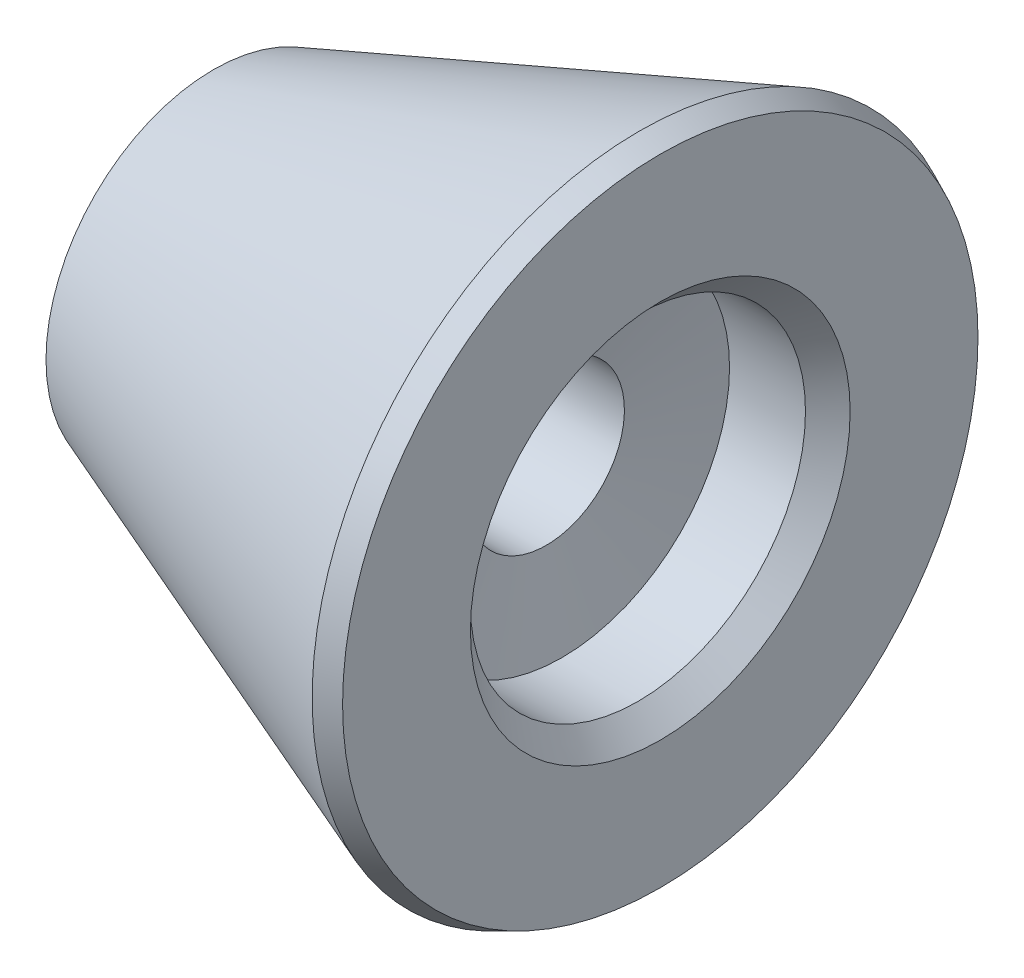
ISO-10303-21;
HEADER;
FILE_DESCRIPTION(('STEP AP214'),'2;1');
FILE_NAME('part.step','',(''),(''),'','','');
FILE_SCHEMA(('AUTOMOTIVE_DESIGN { 1 0 10303 214 1 1 1 1 }'));
ENDSEC;
DATA;
#1=APPLICATION_CONTEXT('core data for automotive mechanical design processes');
#2=APPLICATION_PROTOCOL_DEFINITION('international standard','automotive_design',2000,#1);
#3=PRODUCT_CONTEXT('',#1,'mechanical');
#4=PRODUCT('Part','Part','',(#3));
#5=PRODUCT_RELATED_PRODUCT_CATEGORY('part','',(#4));
#6=PRODUCT_DEFINITION_FORMATION('','',#4);
#7=PRODUCT_DEFINITION_CONTEXT('part definition',#1,'design');
#8=PRODUCT_DEFINITION('design','',#6,#7);
#9=PRODUCT_DEFINITION_SHAPE('','',#8);
#10=(LENGTH_UNIT() NAMED_UNIT(*) SI_UNIT(.MILLI.,.METRE.));
#11=(NAMED_UNIT(*) PLANE_ANGLE_UNIT() SI_UNIT($,.RADIAN.));
#12=(NAMED_UNIT(*) SI_UNIT($,.STERADIAN.) SOLID_ANGLE_UNIT());
#13=UNCERTAINTY_MEASURE_WITH_UNIT(LENGTH_MEASURE(1.E-05),#10,'distance_accuracy_value','');
#14=(GEOMETRIC_REPRESENTATION_CONTEXT(3) GLOBAL_UNCERTAINTY_ASSIGNED_CONTEXT((#13)) GLOBAL_UNIT_ASSIGNED_CONTEXT((#10,
#11,#12)) REPRESENTATION_CONTEXT('',''));
#15=CARTESIAN_POINT('',(0.,0.,0.));
#16=DIRECTION('',(0.,0.,1.));
#17=DIRECTION('',(1.,0.,0.));
#18=AXIS2_PLACEMENT_3D('',#15,#16,#17);
#19=CARTESIAN_POINT('',(0.,0.,0.));
#20=DIRECTION('',(1.,0.,0.));
#21=DIRECTION('',(0.,1.,0.));
#22=AXIS2_PLACEMENT_3D('',#19,#20,#21);
#23=CYLINDRICAL_SURFACE('',#22,3.50000000000001);
#24=CARTESIAN_POINT('',(4.89469207716618,0.,0.));
#25=DIRECTION('',(1.,0.,0.));
#26=DIRECTION('',(0.,1.,0.));
#27=AXIS2_PLACEMENT_3D('',#24,#25,#26);
#28=CIRCLE('',#27,3.49999999999999);
#29=CARTESIAN_POINT('',(4.89469207716617,3.50000000000001,0.));
#30=VERTEX_POINT('',#29);
#31=EDGE_CURVE('E153',#30,#30,#28,.T.);
#32=ORIENTED_EDGE('',*,*,#31,.T.);
#33=EDGE_LOOP('',(#32));
#34=FACE_BOUND('',#33,.T.);
#35=CARTESIAN_POINT('',(-4.79999999999998,0.,0.));
#36=DIRECTION('',(-1.,0.,0.));
#37=DIRECTION('',(0.,-1.,0.));
#38=AXIS2_PLACEMENT_3D('',#35,#36,#37);
#39=CIRCLE('',#38,3.50000000000001);
#40=CARTESIAN_POINT('',(-4.79999999999997,-3.50000000000003,0.));
#41=VERTEX_POINT('',#40);
#42=EDGE_CURVE('E144',#41,#41,#39,.T.);
#43=ORIENTED_EDGE('',*,*,#42,.T.);
#44=EDGE_LOOP('',(#43));
#45=FACE_BOUND('',#44,.T.);
#46=ADVANCED_FACE('F41',(#34,#45),#23,.F.);
#47=CARTESIAN_POINT('',(10.0000000000001,0.,0.));
#48=DIRECTION('',(1.,0.,0.));
#49=DIRECTION('',(0.,1.,0.));
#50=AXIS2_PLACEMENT_3D('',#47,#48,#49);
#51=CONICAL_SURFACE('',#50,15.,0.358770670270569);
#52=CARTESIAN_POINT('',(9.06367082243101,0.,0.));
#53=DIRECTION('',(-1.,0.,0.));
#54=DIRECTION('',(0.,-1.,0.));
#55=AXIS2_PLACEMENT_3D('',#52,#53,#54);
#56=CIRCLE('',#55,14.6488765584116);
#57=CARTESIAN_POINT('',(9.06367082243106,-14.6488765584115,0.));
#58=VERTEX_POINT('',#57);
#59=EDGE_CURVE('E11',#58,#58,#56,.T.);
#60=ORIENTED_EDGE('',*,*,#59,.T.);
#61=EDGE_LOOP('',(#60));
#62=FACE_BOUND('',#61,.T.);
#63=CARTESIAN_POINT('',(-9.99999999999997,0.,0.));
#64=DIRECTION('',(1.,0.,0.));
#65=DIRECTION('',(0.,1.,0.));
#66=AXIS2_PLACEMENT_3D('',#63,#64,#65);
#67=CIRCLE('',#66,7.50000000000003);
#68=CARTESIAN_POINT('',(-10.,7.5,0.));
#69=VERTEX_POINT('',#68);
#70=EDGE_CURVE('E150',#69,#69,#67,.T.);
#71=ORIENTED_EDGE('',*,*,#70,.T.);
#72=EDGE_LOOP('',(#71));
#73=FACE_BOUND('',#72,.T.);
#74=ADVANCED_FACE('F192',(#62,#73),#51,.T.);
#75=CARTESIAN_POINT('',(10.,7.5,0.));
#76=DIRECTION('',(1.,0.,0.));
#77=DIRECTION('',(0.,1.,0.));
#78=AXIS2_PLACEMENT_3D('',#75,#76,#77);
#79=PLANE('',#78);
#80=CARTESIAN_POINT('',(10.,0.,0.));
#81=DIRECTION('',(1.,0.,0.));
#82=DIRECTION('',(0.,1.,0.));
#83=AXIS2_PLACEMENT_3D('',#80,#81,#82);
#84=CIRCLE('',#83,8.49999999999998);
#85=CARTESIAN_POINT('',(10.,8.50000000000002,0.));
#86=VERTEX_POINT('',#85);
#87=EDGE_CURVE('E50',#86,#86,#84,.F.);
#88=ORIENTED_EDGE('',*,*,#87,.T.);
#89=EDGE_LOOP('',(#88));
#90=FACE_BOUND('',#89,.T.);
#91=CARTESIAN_POINT('',(10.,0.,0.));
#92=DIRECTION('',(1.,0.,0.));
#93=DIRECTION('',(0.,1.,0.));
#94=AXIS2_PLACEMENT_3D('',#91,#92,#93);
#95=CIRCLE('',#94,14.2232723867893);
#96=CARTESIAN_POINT('',(9.99999999999999,14.2232723867893,0.));
#97=VERTEX_POINT('',#96);
#98=EDGE_CURVE('E164',#97,#97,#95,.T.);
#99=ORIENTED_EDGE('',*,*,#98,.T.);
#100=EDGE_LOOP('',(#99));
#101=FACE_BOUND('',#100,.T.);
#102=ADVANCED_FACE('F169',(#90,#101),#79,.T.);
#103=CARTESIAN_POINT('',(0.,0.,0.));
#104=DIRECTION('',(1.,0.,0.));
#105=DIRECTION('',(0.,1.,0.));
#106=AXIS2_PLACEMENT_3D('',#103,#104,#105);
#107=CYLINDRICAL_SURFACE('',#106,7.49999999999997);
#108=CARTESIAN_POINT('',(9.00000000000003,0.,0.));
#109=DIRECTION('',(1.,0.,0.));
#110=DIRECTION('',(0.,1.,0.));
#111=AXIS2_PLACEMENT_3D('',#108,#109,#110);
#112=CIRCLE('',#111,7.49999999999997);
#113=CARTESIAN_POINT('',(9.,7.5,0.));
#114=VERTEX_POINT('',#113);
#115=EDGE_CURVE('E159',#114,#114,#112,.T.);
#116=ORIENTED_EDGE('',*,*,#115,.T.);
#117=EDGE_LOOP('',(#116));
#118=FACE_BOUND('',#117,.T.);
#119=CARTESIAN_POINT('',(5.60000000000003,0.,0.));
#120=DIRECTION('',(1.,0.,0.));
#121=DIRECTION('',(0.,1.,0.));
#122=AXIS2_PLACEMENT_3D('',#119,#120,#121);
#123=CIRCLE('',#122,7.49999999999998);
#124=CARTESIAN_POINT('',(5.6,7.5,0.));
#125=VERTEX_POINT('',#124);
#126=EDGE_CURVE('E156',#125,#125,#123,.T.);
#127=ORIENTED_EDGE('',*,*,#126,.F.);
#128=EDGE_LOOP('',(#127));
#129=FACE_BOUND('',#128,.T.);
#130=ADVANCED_FACE('F177',(#118,#129),#107,.F.);
#131=CARTESIAN_POINT('',(4.89469207716618,0.,0.));
#132=DIRECTION('',(1.,0.,0.));
#133=DIRECTION('',(0.,1.,0.));
#134=AXIS2_PLACEMENT_3D('',#131,#132,#133);
#135=CONICAL_SURFACE('',#134,3.49999999999999,1.39626340159547);
#136=ORIENTED_EDGE('',*,*,#126,.T.);
#137=EDGE_LOOP('',(#136));
#138=FACE_BOUND('',#137,.T.);
#139=ORIENTED_EDGE('',*,*,#31,.F.);
#140=EDGE_LOOP('',(#139));
#141=FACE_BOUND('',#140,.T.);
#142=ADVANCED_FACE('F180',(#138,#141),#135,.F.);
#143=CARTESIAN_POINT('',(-9.99999999999999,3.5,0.));
#144=DIRECTION('',(-1.,0.,0.));
#145=DIRECTION('',(0.,-1.,0.));
#146=AXIS2_PLACEMENT_3D('',#143,#144,#145);
#147=PLANE('',#146);
#148=DIRECTION('',(0.,-1.,0.));
#149=VECTOR('',#148,1.);
#150=CARTESIAN_POINT('',(-9.99999999999999,3.05995642670498,-5.3));
#151=LINE('',#150,#149);
#152=CARTESIAN_POINT('',(-9.99999999999999,3.05995642670498,-5.3));
#153=VERTEX_POINT('',#152);
#154=CARTESIAN_POINT('',(-9.99999999999997,-3.05995642670505,-5.3));
#155=VERTEX_POINT('',#154);
#156=EDGE_CURVE('E57',#153,#155,#151,.T.);
#157=ORIENTED_EDGE('',*,*,#156,.F.);
#158=DIRECTION('',(0.,-0.5,-0.866025403784439));
#159=VECTOR('',#158,1.);
#160=CARTESIAN_POINT('',(-10.,6.11991285341,0.));
#161=LINE('',#160,#159);
#162=CARTESIAN_POINT('',(-10.,6.11991285341,0.));
#163=VERTEX_POINT('',#162);
#164=EDGE_CURVE('E140',#163,#153,#161,.T.);
#165=ORIENTED_EDGE('',*,*,#164,.F.);
#166=DIRECTION('',(0.,0.5,-0.866025403784439));
#167=VECTOR('',#166,1.);
#168=CARTESIAN_POINT('',(-9.99999999999999,3.05995642670498,5.3));
#169=LINE('',#168,#167);
#170=CARTESIAN_POINT('',(-9.99999999999999,3.05995642670498,5.3));
#171=VERTEX_POINT('',#170);
#172=EDGE_CURVE('E138',#171,#163,#169,.T.);
#173=ORIENTED_EDGE('',*,*,#172,.F.);
#174=DIRECTION('',(0.,1.,0.));
#175=VECTOR('',#174,1.);
#176=CARTESIAN_POINT('',(-9.99999999999997,-3.05995642670505,5.3));
#177=LINE('',#176,#175);
#178=CARTESIAN_POINT('',(-9.99999999999997,-3.05995642670505,5.3));
#179=VERTEX_POINT('',#178);
#180=EDGE_CURVE('E105',#179,#171,#177,.T.);
#181=ORIENTED_EDGE('',*,*,#180,.F.);
#182=DIRECTION('',(0.,0.5,0.866025403784439));
#183=VECTOR('',#182,1.);
#184=CARTESIAN_POINT('',(-9.99999999999996,-6.11991285341007,0.));
#185=LINE('',#184,#183);
#186=CARTESIAN_POINT('',(-9.99999999999996,-6.11991285341007,0.));
#187=VERTEX_POINT('',#186);
#188=EDGE_CURVE('E134',#187,#179,#185,.T.);
#189=ORIENTED_EDGE('',*,*,#188,.F.);
#190=DIRECTION('',(0.,-0.5,0.866025403784439));
#191=VECTOR('',#190,1.);
#192=CARTESIAN_POINT('',(-9.99999999999997,-3.05995642670505,-5.3));
#193=LINE('',#192,#191);
#194=EDGE_CURVE('E131',#155,#187,#193,.T.);
#195=ORIENTED_EDGE('',*,*,#194,.F.);
#196=EDGE_LOOP('',(#157,#165,#173,#181,#189,#195));
#197=FACE_BOUND('',#196,.T.);
#198=ORIENTED_EDGE('',*,*,#70,.F.);
#199=EDGE_LOOP('',(#198));
#200=FACE_BOUND('',#199,.T.);
#201=ADVANCED_FACE('F186',(#197,#200),#147,.T.);
#202=CARTESIAN_POINT('',(-4.79999999999999,3.059956426705,-5.3));
#203=DIRECTION('',(0.,0.,-1.));
#204=DIRECTION('',(-1.,0.,0.));
#205=AXIS2_PLACEMENT_3D('',#202,#203,#204);
#206=PLANE('',#205);
#207=ORIENTED_EDGE('',*,*,#156,.T.);
#208=DIRECTION('',(-1.,0.,0.));
#209=VECTOR('',#208,1.);
#210=CARTESIAN_POINT('',(-4.79999999999997,-3.05995642670503,-5.3));
#211=LINE('',#210,#209);
#212=CARTESIAN_POINT('',(-4.79999999999997,-3.05995642670503,-5.3));
#213=VERTEX_POINT('',#212);
#214=EDGE_CURVE('E87',#213,#155,#211,.T.);
#215=ORIENTED_EDGE('',*,*,#214,.F.);
#216=DIRECTION('',(0.,-1.,0.));
#217=VECTOR('',#216,1.);
#218=CARTESIAN_POINT('',(-4.79999999999999,3.059956426705,-5.3));
#219=LINE('',#218,#217);
#220=CARTESIAN_POINT('',(-4.79999999999999,3.059956426705,-5.3));
#221=VERTEX_POINT('',#220);
#222=EDGE_CURVE('E142',#221,#213,#219,.T.);
#223=ORIENTED_EDGE('',*,*,#222,.F.);
#224=DIRECTION('',(-1.,0.,0.));
#225=VECTOR('',#224,1.);
#226=CARTESIAN_POINT('',(-4.79999999999999,3.059956426705,-5.3));
#227=LINE('',#226,#225);
#228=EDGE_CURVE('E65',#221,#153,#227,.T.);
#229=ORIENTED_EDGE('',*,*,#228,.T.);
#230=EDGE_LOOP('',(#207,#215,#223,#229));
#231=FACE_BOUND('',#230,.T.);
#232=ADVANCED_FACE('F210',(#231),#206,.F.);
#233=CARTESIAN_POINT('',(-4.8,6.11991285341002,0.));
#234=DIRECTION('',(0.,0.866025403784439,-0.5));
#235=DIRECTION('',(0.,0.5,0.866025403784439));
#236=AXIS2_PLACEMENT_3D('',#233,#234,#235);
#237=PLANE('',#236);
#238=ORIENTED_EDGE('',*,*,#164,.T.);
#239=ORIENTED_EDGE('',*,*,#228,.F.);
#240=DIRECTION('',(0.,-0.5,-0.866025403784439));
#241=VECTOR('',#240,1.);
#242=CARTESIAN_POINT('',(-4.8,6.11991285341002,0.));
#243=LINE('',#242,#241);
#244=CARTESIAN_POINT('',(-4.8,6.11991285341002,0.));
#245=VERTEX_POINT('',#244);
#246=EDGE_CURVE('E117',#245,#221,#243,.T.);
#247=ORIENTED_EDGE('',*,*,#246,.F.);
#248=DIRECTION('',(-1.,0.,0.));
#249=VECTOR('',#248,1.);
#250=CARTESIAN_POINT('',(-4.8,6.11991285341002,0.));
#251=LINE('',#250,#249);
#252=EDGE_CURVE('E109',#245,#163,#251,.T.);
#253=ORIENTED_EDGE('',*,*,#252,.T.);
#254=EDGE_LOOP('',(#238,#239,#247,#253));
#255=FACE_BOUND('',#254,.T.);
#256=ADVANCED_FACE('F207',(#255),#237,.F.);
#257=CARTESIAN_POINT('',(-4.79999999999999,3.059956426705,5.3));
#258=DIRECTION('',(0.,0.866025403784439,0.5));
#259=DIRECTION('',(0.,-0.5,0.866025403784439));
#260=AXIS2_PLACEMENT_3D('',#257,#258,#259);
#261=PLANE('',#260);
#262=ORIENTED_EDGE('',*,*,#172,.T.);
#263=ORIENTED_EDGE('',*,*,#252,.F.);
#264=DIRECTION('',(0.,0.5,-0.866025403784439));
#265=VECTOR('',#264,1.);
#266=CARTESIAN_POINT('',(-4.79999999999999,3.059956426705,5.3));
#267=LINE('',#266,#265);
#268=CARTESIAN_POINT('',(-4.79999999999999,3.059956426705,5.3));
#269=VERTEX_POINT('',#268);
#270=EDGE_CURVE('E113',#269,#245,#267,.T.);
#271=ORIENTED_EDGE('',*,*,#270,.F.);
#272=DIRECTION('',(-1.,0.,0.));
#273=VECTOR('',#272,1.);
#274=CARTESIAN_POINT('',(-4.79999999999999,3.059956426705,5.3));
#275=LINE('',#274,#273);
#276=EDGE_CURVE('E98',#269,#171,#275,.T.);
#277=ORIENTED_EDGE('',*,*,#276,.T.);
#278=EDGE_LOOP('',(#262,#263,#271,#277));
#279=FACE_BOUND('',#278,.T.);
#280=ADVANCED_FACE('F114',(#279),#261,.F.);
#281=CARTESIAN_POINT('',(-4.79999999999997,-3.05995642670503,5.3));
#282=DIRECTION('',(0.,0.,1.));
#283=DIRECTION('',(1.,0.,0.));
#284=AXIS2_PLACEMENT_3D('',#281,#282,#283);
#285=PLANE('',#284);
#286=ORIENTED_EDGE('',*,*,#180,.T.);
#287=ORIENTED_EDGE('',*,*,#276,.F.);
#288=DIRECTION('',(0.,1.,0.));
#289=VECTOR('',#288,1.);
#290=CARTESIAN_POINT('',(-4.79999999999997,-3.05995642670503,5.3));
#291=LINE('',#290,#289);
#292=CARTESIAN_POINT('',(-4.79999999999997,-3.05995642670503,5.3));
#293=VERTEX_POINT('',#292);
#294=EDGE_CURVE('E102',#293,#269,#291,.T.);
#295=ORIENTED_EDGE('',*,*,#294,.F.);
#296=DIRECTION('',(-1.,0.,0.));
#297=VECTOR('',#296,1.);
#298=CARTESIAN_POINT('',(-4.79999999999997,-3.05995642670503,5.3));
#299=LINE('',#298,#297);
#300=EDGE_CURVE('E110',#293,#179,#299,.T.);
#301=ORIENTED_EDGE('',*,*,#300,.T.);
#302=EDGE_LOOP('',(#286,#287,#295,#301));
#303=FACE_BOUND('',#302,.T.);
#304=ADVANCED_FACE('F100',(#303),#285,.F.);
#305=CARTESIAN_POINT('',(-4.79999999999996,-6.11991285341005,0.));
#306=DIRECTION('',(0.,-0.866025403784438,0.5));
#307=DIRECTION('',(0.,-0.5,-0.866025403784439));
#308=AXIS2_PLACEMENT_3D('',#305,#306,#307);
#309=PLANE('',#308);
#310=ORIENTED_EDGE('',*,*,#188,.T.);
#311=ORIENTED_EDGE('',*,*,#300,.F.);
#312=DIRECTION('',(0.,0.5,0.866025403784439));
#313=VECTOR('',#312,1.);
#314=CARTESIAN_POINT('',(-4.79999999999996,-6.11991285341005,0.));
#315=LINE('',#314,#313);
#316=CARTESIAN_POINT('',(-4.79999999999996,-6.11991285341005,0.));
#317=VERTEX_POINT('',#316);
#318=EDGE_CURVE('E123',#317,#293,#315,.T.);
#319=ORIENTED_EDGE('',*,*,#318,.F.);
#320=DIRECTION('',(-1.,0.,0.));
#321=VECTOR('',#320,1.);
#322=CARTESIAN_POINT('',(-4.79999999999996,-6.11991285341005,0.));
#323=LINE('',#322,#321);
#324=EDGE_CURVE('E147',#317,#187,#323,.T.);
#325=ORIENTED_EDGE('',*,*,#324,.T.);
#326=EDGE_LOOP('',(#310,#311,#319,#325));
#327=FACE_BOUND('',#326,.T.);
#328=ADVANCED_FACE('F203',(#327),#309,.F.);
#329=CARTESIAN_POINT('',(-4.79999999999997,-3.05995642670503,-5.3));
#330=DIRECTION('',(0.,-0.866025403784439,-0.5));
#331=DIRECTION('',(0.,0.5,-0.866025403784439));
#332=AXIS2_PLACEMENT_3D('',#329,#330,#331);
#333=PLANE('',#332);
#334=ORIENTED_EDGE('',*,*,#194,.T.);
#335=ORIENTED_EDGE('',*,*,#324,.F.);
#336=DIRECTION('',(0.,-0.5,0.866025403784439));
#337=VECTOR('',#336,1.);
#338=CARTESIAN_POINT('',(-4.79999999999997,-3.05995642670503,-5.3));
#339=LINE('',#338,#337);
#340=EDGE_CURVE('E125',#213,#317,#339,.T.);
#341=ORIENTED_EDGE('',*,*,#340,.F.);
#342=ORIENTED_EDGE('',*,*,#214,.T.);
#343=EDGE_LOOP('',(#334,#335,#341,#342));
#344=FACE_BOUND('',#343,.T.);
#345=ADVANCED_FACE('F197',(#344),#333,.F.);
#346=CARTESIAN_POINT('',(-4.79999999999998,0.,0.));
#347=DIRECTION('',(-1.,0.,0.));
#348=DIRECTION('',(0.,-1.,0.));
#349=AXIS2_PLACEMENT_3D('',#346,#347,#348);
#350=PLANE('',#349);
#351=ORIENTED_EDGE('',*,*,#42,.F.);
#352=EDGE_LOOP('',(#351));
#353=FACE_BOUND('',#352,.T.);
#354=ORIENTED_EDGE('',*,*,#222,.T.);
#355=ORIENTED_EDGE('',*,*,#340,.T.);
#356=ORIENTED_EDGE('',*,*,#318,.T.);
#357=ORIENTED_EDGE('',*,*,#294,.T.);
#358=ORIENTED_EDGE('',*,*,#270,.T.);
#359=ORIENTED_EDGE('',*,*,#246,.T.);
#360=EDGE_LOOP('',(#354,#355,#356,#357,#358,#359));
#361=FACE_BOUND('',#360,.T.);
#362=ADVANCED_FACE('F120',(#353,#361),#350,.T.);
#363=CARTESIAN_POINT('',(9.00000000000003,0.,0.));
#364=DIRECTION('',(1.,0.,0.));
#365=DIRECTION('',(0.,1.,0.));
#366=AXIS2_PLACEMENT_3D('',#363,#364,#365);
#367=CONICAL_SURFACE('',#366,7.49999999999997,0.785398163397448);
#368=ORIENTED_EDGE('',*,*,#87,.F.);
#369=EDGE_LOOP('',(#368));
#370=FACE_BOUND('',#369,.T.);
#371=ORIENTED_EDGE('',*,*,#115,.F.);
#372=EDGE_LOOP('',(#371));
#373=FACE_BOUND('',#372,.T.);
#374=ADVANCED_FACE('F172',(#370,#373),#367,.F.);
#375=CARTESIAN_POINT('',(10.,0.,0.));
#376=DIRECTION('',(-1.,0.,0.));
#377=DIRECTION('',(0.,-1.,0.));
#378=AXIS2_PLACEMENT_3D('',#375,#376,#377);
#379=CONICAL_SURFACE('',#378,14.2232723867893,0.426627493126871);
#380=ORIENTED_EDGE('',*,*,#59,.F.);
#381=EDGE_LOOP('',(#380));
#382=FACE_BOUND('',#381,.T.);
#383=ORIENTED_EDGE('',*,*,#98,.F.);
#384=EDGE_LOOP('',(#383));
#385=FACE_BOUND('',#384,.T.);
#386=ADVANCED_FACE('F44',(#382,#385),#379,.T.);
#387=CLOSED_SHELL('',(#46,#74,#102,#130,#142,#201,#232,#256,#280,#304,#328,#345,#362,#374,#386));
#388=MANIFOLD_SOLID_BREP('B2',#387);
#389=ADVANCED_BREP_SHAPE_REPRESENTATION('',(#18,#388),#14);
#390=SHAPE_DEFINITION_REPRESENTATION(#9,#389);
ENDSEC;
END-ISO-10303-21;
